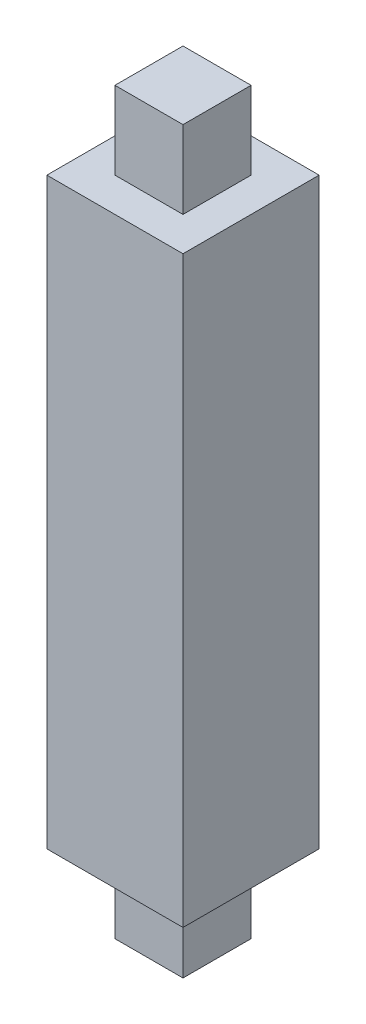
ISO-10303-21;
HEADER;
FILE_DESCRIPTION(('STEP AP214'),'2;1');
FILE_NAME('part.step','',(''),(''),'','','');
FILE_SCHEMA(('AUTOMOTIVE_DESIGN { 1 0 10303 214 1 1 1 1 }'));
ENDSEC;
DATA;
#1=APPLICATION_CONTEXT('core data for automotive mechanical design processes');
#2=APPLICATION_PROTOCOL_DEFINITION('international standard','automotive_design',2000,#1);
#3=PRODUCT_CONTEXT('',#1,'mechanical');
#4=PRODUCT('Part','Part','',(#3));
#5=PRODUCT_RELATED_PRODUCT_CATEGORY('part','',(#4));
#6=PRODUCT_DEFINITION_FORMATION('','',#4);
#7=PRODUCT_DEFINITION_CONTEXT('part definition',#1,'design');
#8=PRODUCT_DEFINITION('design','',#6,#7);
#9=PRODUCT_DEFINITION_SHAPE('','',#8);
#10=(LENGTH_UNIT() NAMED_UNIT(*) SI_UNIT(.MILLI.,.METRE.));
#11=(NAMED_UNIT(*) PLANE_ANGLE_UNIT() SI_UNIT($,.RADIAN.));
#12=(NAMED_UNIT(*) SI_UNIT($,.STERADIAN.) SOLID_ANGLE_UNIT());
#13=UNCERTAINTY_MEASURE_WITH_UNIT(LENGTH_MEASURE(1.E-05),#10,'distance_accuracy_value','');
#14=(GEOMETRIC_REPRESENTATION_CONTEXT(3) GLOBAL_UNCERTAINTY_ASSIGNED_CONTEXT((#13)) GLOBAL_UNIT_ASSIGNED_CONTEXT((#10,
#11,#12)) REPRESENTATION_CONTEXT('',''));
#15=CARTESIAN_POINT('',(0.,0.,0.));
#16=DIRECTION('',(0.,0.,1.));
#17=DIRECTION('',(1.,0.,0.));
#18=AXIS2_PLACEMENT_3D('',#15,#16,#17);
#19=CARTESIAN_POINT('',(0.,-15.,0.));
#20=DIRECTION('',(0.,1.,0.));
#21=DIRECTION('',(0.,0.,1.));
#22=AXIS2_PLACEMENT_3D('',#19,#20,#21);
#23=PLANE('',#22);
#24=DIRECTION('',(0.,0.,-1.));
#25=VECTOR('',#24,1.);
#26=CARTESIAN_POINT('',(3.5,-15.,-3.5));
#27=LINE('',#26,#25);
#28=CARTESIAN_POINT('',(3.5,-15.,3.5));
#29=VERTEX_POINT('',#28);
#30=CARTESIAN_POINT('',(3.5,-15.,-3.5));
#31=VERTEX_POINT('',#30);
#32=EDGE_CURVE('E177',#29,#31,#27,.T.);
#33=ORIENTED_EDGE('',*,*,#32,.F.);
#34=DIRECTION('',(1.,0.,0.));
#35=VECTOR('',#34,1.);
#36=CARTESIAN_POINT('',(-3.5,-15.,3.5));
#37=LINE('',#36,#35);
#38=CARTESIAN_POINT('',(-3.5,-15.,3.5));
#39=VERTEX_POINT('',#38);
#40=EDGE_CURVE('E182',#39,#29,#37,.T.);
#41=ORIENTED_EDGE('',*,*,#40,.F.);
#42=DIRECTION('',(0.,0.,1.));
#43=VECTOR('',#42,1.);
#44=CARTESIAN_POINT('',(-3.5,-15.,-3.5));
#45=LINE('',#44,#43);
#46=CARTESIAN_POINT('',(-3.5,-15.,-3.5));
#47=VERTEX_POINT('',#46);
#48=EDGE_CURVE('E193',#47,#39,#45,.T.);
#49=ORIENTED_EDGE('',*,*,#48,.F.);
#50=DIRECTION('',(-1.,0.,0.));
#51=VECTOR('',#50,1.);
#52=CARTESIAN_POINT('',(-3.5,-15.,-3.5));
#53=LINE('',#52,#51);
#54=EDGE_CURVE('E191',#31,#47,#53,.T.);
#55=ORIENTED_EDGE('',*,*,#54,.F.);
#56=EDGE_LOOP('',(#33,#41,#49,#55));
#57=FACE_BOUND('',#56,.T.);
#58=DIRECTION('',(0.,0.,-1.));
#59=VECTOR('',#58,1.);
#60=CARTESIAN_POINT('',(-1.75,-15.,-1.75));
#61=LINE('',#60,#59);
#62=CARTESIAN_POINT('',(-1.75,-15.,1.75));
#63=VERTEX_POINT('',#62);
#64=CARTESIAN_POINT('',(-1.75,-15.,-1.75));
#65=VERTEX_POINT('',#64);
#66=EDGE_CURVE('E142',#63,#65,#61,.T.);
#67=ORIENTED_EDGE('',*,*,#66,.F.);
#68=DIRECTION('',(-1.,0.,0.));
#69=VECTOR('',#68,1.);
#70=CARTESIAN_POINT('',(1.75,-15.,1.75));
#71=LINE('',#70,#69);
#72=CARTESIAN_POINT('',(1.75,-15.,1.75));
#73=VERTEX_POINT('',#72);
#74=EDGE_CURVE('E139',#73,#63,#71,.T.);
#75=ORIENTED_EDGE('',*,*,#74,.F.);
#76=DIRECTION('',(0.,0.,1.));
#77=VECTOR('',#76,1.);
#78=CARTESIAN_POINT('',(1.75,-15.,-1.75));
#79=LINE('',#78,#77);
#80=CARTESIAN_POINT('',(1.75,-15.,-1.75));
#81=VERTEX_POINT('',#80);
#82=EDGE_CURVE('E53',#81,#73,#79,.T.);
#83=ORIENTED_EDGE('',*,*,#82,.F.);
#84=DIRECTION('',(1.,0.,0.));
#85=VECTOR('',#84,1.);
#86=CARTESIAN_POINT('',(1.75,-15.,-1.75));
#87=LINE('',#86,#85);
#88=EDGE_CURVE('E48',#65,#81,#87,.T.);
#89=ORIENTED_EDGE('',*,*,#88,.F.);
#90=EDGE_LOOP('',(#67,#75,#83,#89));
#91=FACE_BOUND('',#90,.T.);
#92=ADVANCED_FACE('F33',(#57,#91),#23,.F.);
#93=CARTESIAN_POINT('',(0.,15.,0.));
#94=DIRECTION('',(0.,1.,0.));
#95=DIRECTION('',(0.,0.,1.));
#96=AXIS2_PLACEMENT_3D('',#93,#94,#95);
#97=PLANE('',#96);
#98=DIRECTION('',(0.,0.,-1.));
#99=VECTOR('',#98,1.);
#100=CARTESIAN_POINT('',(3.5,15.,-3.5));
#101=LINE('',#100,#99);
#102=CARTESIAN_POINT('',(3.5,15.,3.5));
#103=VERTEX_POINT('',#102);
#104=CARTESIAN_POINT('',(3.5,15.,-3.5));
#105=VERTEX_POINT('',#104);
#106=EDGE_CURVE('E178',#103,#105,#101,.T.);
#107=ORIENTED_EDGE('',*,*,#106,.T.);
#108=DIRECTION('',(-1.,0.,0.));
#109=VECTOR('',#108,1.);
#110=CARTESIAN_POINT('',(-3.5,15.,-3.5));
#111=LINE('',#110,#109);
#112=CARTESIAN_POINT('',(-3.5,15.,-3.5));
#113=VERTEX_POINT('',#112);
#114=EDGE_CURVE('E181',#105,#113,#111,.T.);
#115=ORIENTED_EDGE('',*,*,#114,.T.);
#116=DIRECTION('',(0.,0.,1.));
#117=VECTOR('',#116,1.);
#118=CARTESIAN_POINT('',(-3.5,15.,-3.5));
#119=LINE('',#118,#117);
#120=CARTESIAN_POINT('',(-3.5,15.,3.5));
#121=VERTEX_POINT('',#120);
#122=EDGE_CURVE('E184',#113,#121,#119,.T.);
#123=ORIENTED_EDGE('',*,*,#122,.T.);
#124=DIRECTION('',(1.,0.,0.));
#125=VECTOR('',#124,1.);
#126=CARTESIAN_POINT('',(-3.5,15.,3.5));
#127=LINE('',#126,#125);
#128=EDGE_CURVE('E186',#121,#103,#127,.T.);
#129=ORIENTED_EDGE('',*,*,#128,.T.);
#130=EDGE_LOOP('',(#107,#115,#123,#129));
#131=FACE_BOUND('',#130,.T.);
#132=DIRECTION('',(-1.,0.,0.));
#133=VECTOR('',#132,1.);
#134=CARTESIAN_POINT('',(-1.75,15.,-1.75));
#135=LINE('',#134,#133);
#136=CARTESIAN_POINT('',(1.75,15.,-1.75));
#137=VERTEX_POINT('',#136);
#138=CARTESIAN_POINT('',(-1.75,15.,-1.75));
#139=VERTEX_POINT('',#138);
#140=EDGE_CURVE('E146',#137,#139,#135,.T.);
#141=ORIENTED_EDGE('',*,*,#140,.F.);
#142=DIRECTION('',(0.,0.,-1.));
#143=VECTOR('',#142,1.);
#144=CARTESIAN_POINT('',(1.75,15.,-1.75));
#145=LINE('',#144,#143);
#146=CARTESIAN_POINT('',(1.75,15.,1.75));
#147=VERTEX_POINT('',#146);
#148=EDGE_CURVE('E143',#147,#137,#145,.T.);
#149=ORIENTED_EDGE('',*,*,#148,.F.);
#150=DIRECTION('',(1.,0.,0.));
#151=VECTOR('',#150,1.);
#152=CARTESIAN_POINT('',(-1.75,15.,1.75));
#153=LINE('',#152,#151);
#154=CARTESIAN_POINT('',(-1.75,15.,1.75));
#155=VERTEX_POINT('',#154);
#156=EDGE_CURVE('E156',#155,#147,#153,.T.);
#157=ORIENTED_EDGE('',*,*,#156,.F.);
#158=DIRECTION('',(0.,0.,1.));
#159=VECTOR('',#158,1.);
#160=CARTESIAN_POINT('',(-1.75,15.,-1.75));
#161=LINE('',#160,#159);
#162=EDGE_CURVE('E164',#139,#155,#161,.T.);
#163=ORIENTED_EDGE('',*,*,#162,.F.);
#164=EDGE_LOOP('',(#141,#149,#157,#163));
#165=FACE_BOUND('',#164,.T.);
#166=ADVANCED_FACE('F219',(#131,#165),#97,.T.);
#167=CARTESIAN_POINT('',(3.5,15.,-3.5));
#168=DIRECTION('',(-1.,0.,0.));
#169=DIRECTION('',(0.,0.,1.));
#170=AXIS2_PLACEMENT_3D('',#167,#168,#169);
#171=PLANE('',#170);
#172=ORIENTED_EDGE('',*,*,#32,.T.);
#173=DIRECTION('',(0.,-1.,0.));
#174=VECTOR('',#173,1.);
#175=CARTESIAN_POINT('',(3.5,15.,-3.5));
#176=LINE('',#175,#174);
#177=EDGE_CURVE('E11',#105,#31,#176,.T.);
#178=ORIENTED_EDGE('',*,*,#177,.F.);
#179=ORIENTED_EDGE('',*,*,#106,.F.);
#180=DIRECTION('',(0.,-1.,0.));
#181=VECTOR('',#180,1.);
#182=CARTESIAN_POINT('',(3.5,15.,3.5));
#183=LINE('',#182,#181);
#184=EDGE_CURVE('E188',#103,#29,#183,.T.);
#185=ORIENTED_EDGE('',*,*,#184,.T.);
#186=EDGE_LOOP('',(#172,#178,#179,#185));
#187=FACE_BOUND('',#186,.T.);
#188=ADVANCED_FACE('F35',(#187),#171,.F.);
#189=CARTESIAN_POINT('',(-3.5,15.,-3.5));
#190=DIRECTION('',(0.,0.,1.));
#191=DIRECTION('',(1.,0.,0.));
#192=AXIS2_PLACEMENT_3D('',#189,#190,#191);
#193=PLANE('',#192);
#194=ORIENTED_EDGE('',*,*,#54,.T.);
#195=DIRECTION('',(0.,-1.,0.));
#196=VECTOR('',#195,1.);
#197=CARTESIAN_POINT('',(-3.5,15.,-3.5));
#198=LINE('',#197,#196);
#199=EDGE_CURVE('E41',#113,#47,#198,.T.);
#200=ORIENTED_EDGE('',*,*,#199,.F.);
#201=ORIENTED_EDGE('',*,*,#114,.F.);
#202=ORIENTED_EDGE('',*,*,#177,.T.);
#203=EDGE_LOOP('',(#194,#200,#201,#202));
#204=FACE_BOUND('',#203,.T.);
#205=ADVANCED_FACE('F221',(#204),#193,.F.);
#206=CARTESIAN_POINT('',(-3.5,15.,-3.5));
#207=DIRECTION('',(1.,0.,0.));
#208=DIRECTION('',(0.,0.,-1.));
#209=AXIS2_PLACEMENT_3D('',#206,#207,#208);
#210=PLANE('',#209);
#211=ORIENTED_EDGE('',*,*,#48,.T.);
#212=DIRECTION('',(0.,-1.,0.));
#213=VECTOR('',#212,1.);
#214=CARTESIAN_POINT('',(-3.5,15.,3.5));
#215=LINE('',#214,#213);
#216=EDGE_CURVE('E198',#121,#39,#215,.T.);
#217=ORIENTED_EDGE('',*,*,#216,.F.);
#218=ORIENTED_EDGE('',*,*,#122,.F.);
#219=ORIENTED_EDGE('',*,*,#199,.T.);
#220=EDGE_LOOP('',(#211,#217,#218,#219));
#221=FACE_BOUND('',#220,.T.);
#222=ADVANCED_FACE('F205',(#221),#210,.F.);
#223=CARTESIAN_POINT('',(-3.5,15.,3.5));
#224=DIRECTION('',(0.,0.,-1.));
#225=DIRECTION('',(-1.,0.,0.));
#226=AXIS2_PLACEMENT_3D('',#223,#224,#225);
#227=PLANE('',#226);
#228=ORIENTED_EDGE('',*,*,#40,.T.);
#229=ORIENTED_EDGE('',*,*,#184,.F.);
#230=ORIENTED_EDGE('',*,*,#128,.F.);
#231=ORIENTED_EDGE('',*,*,#216,.T.);
#232=EDGE_LOOP('',(#228,#229,#230,#231));
#233=FACE_BOUND('',#232,.T.);
#234=ADVANCED_FACE('F213',(#233),#227,.F.);
#235=CARTESIAN_POINT('',(1.75,19.,-1.75));
#236=DIRECTION('',(-1.,0.,0.));
#237=DIRECTION('',(0.,0.,1.));
#238=AXIS2_PLACEMENT_3D('',#235,#236,#237);
#239=PLANE('',#238);
#240=ORIENTED_EDGE('',*,*,#148,.T.);
#241=DIRECTION('',(0.,-1.,0.));
#242=VECTOR('',#241,1.);
#243=CARTESIAN_POINT('',(1.75,19.,-1.75));
#244=LINE('',#243,#242);
#245=CARTESIAN_POINT('',(1.75,19.,-1.75));
#246=VERTEX_POINT('',#245);
#247=EDGE_CURVE('E175',#246,#137,#244,.T.);
#248=ORIENTED_EDGE('',*,*,#247,.F.);
#249=DIRECTION('',(0.,0.,-1.));
#250=VECTOR('',#249,1.);
#251=CARTESIAN_POINT('',(1.75,19.,-1.75));
#252=LINE('',#251,#250);
#253=CARTESIAN_POINT('',(1.75,19.,1.75));
#254=VERTEX_POINT('',#253);
#255=EDGE_CURVE('E152',#254,#246,#252,.T.);
#256=ORIENTED_EDGE('',*,*,#255,.F.);
#257=DIRECTION('',(0.,-1.,0.));
#258=VECTOR('',#257,1.);
#259=CARTESIAN_POINT('',(1.75,19.,1.75));
#260=LINE('',#259,#258);
#261=EDGE_CURVE('E161',#254,#147,#260,.T.);
#262=ORIENTED_EDGE('',*,*,#261,.T.);
#263=EDGE_LOOP('',(#240,#248,#256,#262));
#264=FACE_BOUND('',#263,.T.);
#265=ADVANCED_FACE('F237',(#264),#239,.F.);
#266=CARTESIAN_POINT('',(-1.75,19.,-1.75));
#267=DIRECTION('',(0.,0.,1.));
#268=DIRECTION('',(1.,0.,0.));
#269=AXIS2_PLACEMENT_3D('',#266,#267,#268);
#270=PLANE('',#269);
#271=ORIENTED_EDGE('',*,*,#140,.T.);
#272=DIRECTION('',(0.,-1.,0.));
#273=VECTOR('',#272,1.);
#274=CARTESIAN_POINT('',(-1.75,19.,-1.75));
#275=LINE('',#274,#273);
#276=CARTESIAN_POINT('',(-1.75,19.,-1.75));
#277=VERTEX_POINT('',#276);
#278=EDGE_CURVE('E172',#277,#139,#275,.T.);
#279=ORIENTED_EDGE('',*,*,#278,.F.);
#280=DIRECTION('',(-1.,0.,0.));
#281=VECTOR('',#280,1.);
#282=CARTESIAN_POINT('',(-1.75,19.,-1.75));
#283=LINE('',#282,#281);
#284=EDGE_CURVE('E155',#246,#277,#283,.T.);
#285=ORIENTED_EDGE('',*,*,#284,.F.);
#286=ORIENTED_EDGE('',*,*,#247,.T.);
#287=EDGE_LOOP('',(#271,#279,#285,#286));
#288=FACE_BOUND('',#287,.T.);
#289=ADVANCED_FACE('F241',(#288),#270,.F.);
#290=CARTESIAN_POINT('',(-1.75,19.,-1.75));
#291=DIRECTION('',(1.,0.,0.));
#292=DIRECTION('',(0.,0.,-1.));
#293=AXIS2_PLACEMENT_3D('',#290,#291,#292);
#294=PLANE('',#293);
#295=ORIENTED_EDGE('',*,*,#162,.T.);
#296=DIRECTION('',(0.,-1.,0.));
#297=VECTOR('',#296,1.);
#298=CARTESIAN_POINT('',(-1.75,19.,1.75));
#299=LINE('',#298,#297);
#300=CARTESIAN_POINT('',(-1.75,19.,1.75));
#301=VERTEX_POINT('',#300);
#302=EDGE_CURVE('E170',#301,#155,#299,.T.);
#303=ORIENTED_EDGE('',*,*,#302,.F.);
#304=DIRECTION('',(0.,0.,1.));
#305=VECTOR('',#304,1.);
#306=CARTESIAN_POINT('',(-1.75,19.,-1.75));
#307=LINE('',#306,#305);
#308=EDGE_CURVE('E158',#277,#301,#307,.T.);
#309=ORIENTED_EDGE('',*,*,#308,.F.);
#310=ORIENTED_EDGE('',*,*,#278,.T.);
#311=EDGE_LOOP('',(#295,#303,#309,#310));
#312=FACE_BOUND('',#311,.T.);
#313=ADVANCED_FACE('F246',(#312),#294,.F.);
#314=CARTESIAN_POINT('',(-1.75,19.,1.75));
#315=DIRECTION('',(0.,0.,-1.));
#316=DIRECTION('',(-1.,0.,0.));
#317=AXIS2_PLACEMENT_3D('',#314,#315,#316);
#318=PLANE('',#317);
#319=ORIENTED_EDGE('',*,*,#156,.T.);
#320=ORIENTED_EDGE('',*,*,#261,.F.);
#321=DIRECTION('',(1.,0.,0.));
#322=VECTOR('',#321,1.);
#323=CARTESIAN_POINT('',(-1.75,19.,1.75));
#324=LINE('',#323,#322);
#325=EDGE_CURVE('E160',#301,#254,#324,.T.);
#326=ORIENTED_EDGE('',*,*,#325,.F.);
#327=ORIENTED_EDGE('',*,*,#302,.T.);
#328=EDGE_LOOP('',(#319,#320,#326,#327));
#329=FACE_BOUND('',#328,.T.);
#330=ADVANCED_FACE('F252',(#329),#318,.F.);
#331=CARTESIAN_POINT('',(0.,19.,0.));
#332=DIRECTION('',(0.,1.,0.));
#333=DIRECTION('',(0.,0.,1.));
#334=AXIS2_PLACEMENT_3D('',#331,#332,#333);
#335=PLANE('',#334);
#336=ORIENTED_EDGE('',*,*,#255,.T.);
#337=ORIENTED_EDGE('',*,*,#284,.T.);
#338=ORIENTED_EDGE('',*,*,#308,.T.);
#339=ORIENTED_EDGE('',*,*,#325,.T.);
#340=EDGE_LOOP('',(#336,#337,#338,#339));
#341=FACE_BOUND('',#340,.T.);
#342=ADVANCED_FACE('F256',(#341),#335,.T.);
#343=CARTESIAN_POINT('',(-1.75,-19.,-1.75));
#344=DIRECTION('',(1.,0.,0.));
#345=DIRECTION('',(0.,0.,-1.));
#346=AXIS2_PLACEMENT_3D('',#343,#344,#345);
#347=PLANE('',#346);
#348=ORIENTED_EDGE('',*,*,#66,.T.);
#349=DIRECTION('',(0.,1.,0.));
#350=VECTOR('',#349,1.);
#351=CARTESIAN_POINT('',(-1.75,-19.,-1.75));
#352=LINE('',#351,#350);
#353=CARTESIAN_POINT('',(-1.75,-19.,-1.75));
#354=VERTEX_POINT('',#353);
#355=EDGE_CURVE('E123',#354,#65,#352,.T.);
#356=ORIENTED_EDGE('',*,*,#355,.F.);
#357=DIRECTION('',(0.,0.,-1.));
#358=VECTOR('',#357,1.);
#359=CARTESIAN_POINT('',(-1.75,-19.,-1.75));
#360=LINE('',#359,#358);
#361=CARTESIAN_POINT('',(-1.75,-19.,1.75));
#362=VERTEX_POINT('',#361);
#363=EDGE_CURVE('E130',#362,#354,#360,.T.);
#364=ORIENTED_EDGE('',*,*,#363,.F.);
#365=DIRECTION('',(0.,1.,0.));
#366=VECTOR('',#365,1.);
#367=CARTESIAN_POINT('',(-1.75,-19.,1.75));
#368=LINE('',#367,#366);
#369=EDGE_CURVE('E364',#362,#63,#368,.T.);
#370=ORIENTED_EDGE('',*,*,#369,.T.);
#371=EDGE_LOOP('',(#348,#356,#364,#370));
#372=FACE_BOUND('',#371,.T.);
#373=ADVANCED_FACE('F141',(#372),#347,.F.);
#374=CARTESIAN_POINT('',(1.75,-19.,-1.75));
#375=DIRECTION('',(0.,0.,1.));
#376=DIRECTION('',(1.,0.,0.));
#377=AXIS2_PLACEMENT_3D('',#374,#375,#376);
#378=PLANE('',#377);
#379=ORIENTED_EDGE('',*,*,#88,.T.);
#380=DIRECTION('',(0.,1.,0.));
#381=VECTOR('',#380,1.);
#382=CARTESIAN_POINT('',(1.75,-19.,-1.75));
#383=LINE('',#382,#381);
#384=CARTESIAN_POINT('',(1.75,-19.,-1.75));
#385=VERTEX_POINT('',#384);
#386=EDGE_CURVE('E126',#385,#81,#383,.T.);
#387=ORIENTED_EDGE('',*,*,#386,.F.);
#388=DIRECTION('',(1.,0.,0.));
#389=VECTOR('',#388,1.);
#390=CARTESIAN_POINT('',(1.75,-19.,-1.75));
#391=LINE('',#390,#389);
#392=EDGE_CURVE('E119',#354,#385,#391,.T.);
#393=ORIENTED_EDGE('',*,*,#392,.F.);
#394=ORIENTED_EDGE('',*,*,#355,.T.);
#395=EDGE_LOOP('',(#379,#387,#393,#394));
#396=FACE_BOUND('',#395,.T.);
#397=ADVANCED_FACE('F121',(#396),#378,.F.);
#398=CARTESIAN_POINT('',(1.75,-19.,-1.75));
#399=DIRECTION('',(-1.,0.,0.));
#400=DIRECTION('',(0.,0.,1.));
#401=AXIS2_PLACEMENT_3D('',#398,#399,#400);
#402=PLANE('',#401);
#403=ORIENTED_EDGE('',*,*,#82,.T.);
#404=DIRECTION('',(0.,1.,0.));
#405=VECTOR('',#404,1.);
#406=CARTESIAN_POINT('',(1.75,-19.,1.75));
#407=LINE('',#406,#405);
#408=CARTESIAN_POINT('',(1.75,-19.,1.75));
#409=VERTEX_POINT('',#408);
#410=EDGE_CURVE('E148',#409,#73,#407,.T.);
#411=ORIENTED_EDGE('',*,*,#410,.F.);
#412=DIRECTION('',(0.,0.,1.));
#413=VECTOR('',#412,1.);
#414=CARTESIAN_POINT('',(1.75,-19.,-1.75));
#415=LINE('',#414,#413);
#416=EDGE_CURVE('E129',#385,#409,#415,.T.);
#417=ORIENTED_EDGE('',*,*,#416,.F.);
#418=ORIENTED_EDGE('',*,*,#386,.T.);
#419=EDGE_LOOP('',(#403,#411,#417,#418));
#420=FACE_BOUND('',#419,.T.);
#421=ADVANCED_FACE('F265',(#420),#402,.F.);
#422=CARTESIAN_POINT('',(1.75,-19.,1.75));
#423=DIRECTION('',(0.,0.,-1.));
#424=DIRECTION('',(-1.,0.,0.));
#425=AXIS2_PLACEMENT_3D('',#422,#423,#424);
#426=PLANE('',#425);
#427=ORIENTED_EDGE('',*,*,#74,.T.);
#428=ORIENTED_EDGE('',*,*,#369,.F.);
#429=DIRECTION('',(-1.,0.,0.));
#430=VECTOR('',#429,1.);
#431=CARTESIAN_POINT('',(1.75,-19.,1.75));
#432=LINE('',#431,#430);
#433=EDGE_CURVE('E135',#409,#362,#432,.T.);
#434=ORIENTED_EDGE('',*,*,#433,.F.);
#435=ORIENTED_EDGE('',*,*,#410,.T.);
#436=EDGE_LOOP('',(#427,#428,#434,#435));
#437=FACE_BOUND('',#436,.T.);
#438=ADVANCED_FACE('F268',(#437),#426,.F.);
#439=CARTESIAN_POINT('',(0.,-19.,0.));
#440=DIRECTION('',(0.,-1.,0.));
#441=DIRECTION('',(0.,0.,-1.));
#442=AXIS2_PLACEMENT_3D('',#439,#440,#441);
#443=PLANE('',#442);
#444=ORIENTED_EDGE('',*,*,#363,.T.);
#445=ORIENTED_EDGE('',*,*,#392,.T.);
#446=ORIENTED_EDGE('',*,*,#416,.T.);
#447=ORIENTED_EDGE('',*,*,#433,.T.);
#448=EDGE_LOOP('',(#444,#445,#446,#447));
#449=FACE_BOUND('',#448,.T.);
#450=ADVANCED_FACE('F133',(#449),#443,.T.);
#451=CLOSED_SHELL('',(#92,#166,#188,#205,#222,#234,#265,#289,#313,#330,#342,#373,#397,#421,#438,#450));
#452=MANIFOLD_SOLID_BREP('B2',#451);
#453=ADVANCED_BREP_SHAPE_REPRESENTATION('',(#18,#452),#14);
#454=SHAPE_DEFINITION_REPRESENTATION(#9,#453);
ENDSEC;
END-ISO-10303-21;
